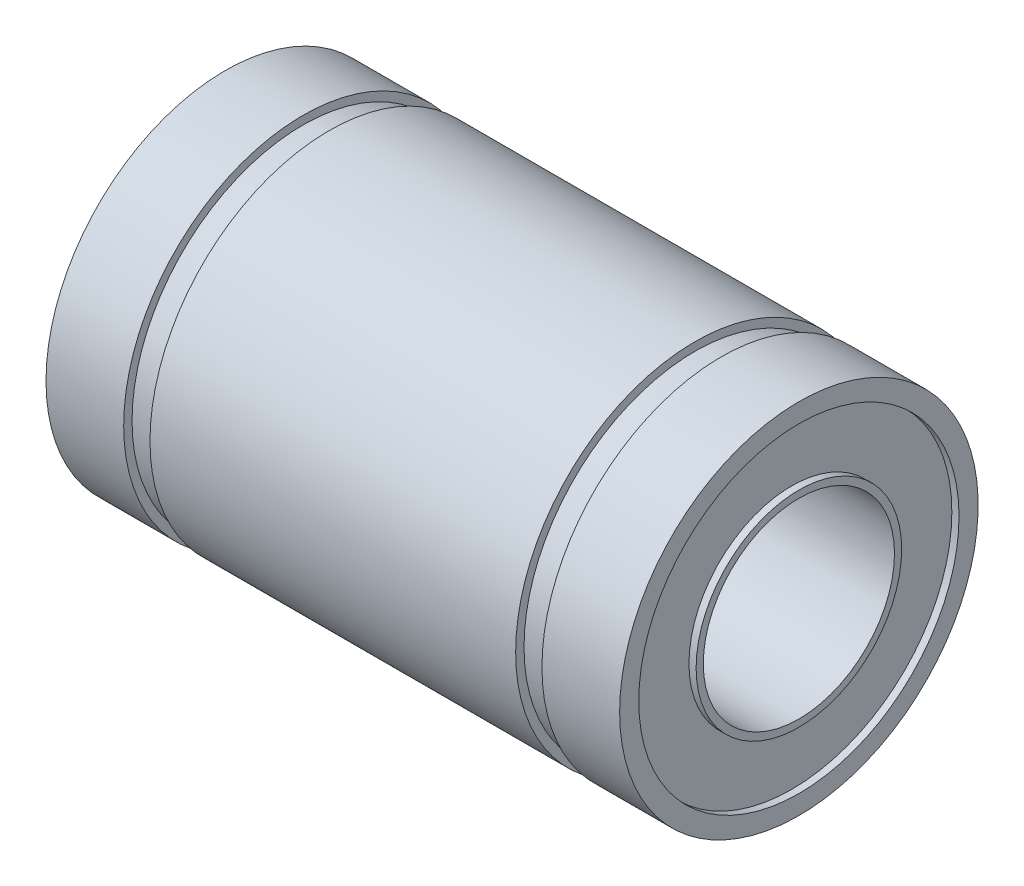
ISO-10303-21;
HEADER;
FILE_DESCRIPTION(('STEP AP214'),'2;1');
FILE_NAME('part.step','',(''),(''),'','','');
FILE_SCHEMA(('AUTOMOTIVE_DESIGN { 1 0 10303 214 1 1 1 1 }'));
ENDSEC;
DATA;
#1=APPLICATION_CONTEXT('core data for automotive mechanical design processes');
#2=APPLICATION_PROTOCOL_DEFINITION('international standard','automotive_design',2000,#1);
#3=PRODUCT_CONTEXT('',#1,'mechanical');
#4=PRODUCT('Part','Part','',(#3));
#5=PRODUCT_RELATED_PRODUCT_CATEGORY('part','',(#4));
#6=PRODUCT_DEFINITION_FORMATION('','',#4);
#7=PRODUCT_DEFINITION_CONTEXT('part definition',#1,'design');
#8=PRODUCT_DEFINITION('design','',#6,#7);
#9=PRODUCT_DEFINITION_SHAPE('','',#8);
#10=(LENGTH_UNIT() NAMED_UNIT(*) SI_UNIT(.MILLI.,.METRE.));
#11=(NAMED_UNIT(*) PLANE_ANGLE_UNIT() SI_UNIT($,.RADIAN.));
#12=(NAMED_UNIT(*) SI_UNIT($,.STERADIAN.) SOLID_ANGLE_UNIT());
#13=UNCERTAINTY_MEASURE_WITH_UNIT(LENGTH_MEASURE(1.E-05),#10,'distance_accuracy_value','');
#14=(GEOMETRIC_REPRESENTATION_CONTEXT(3) GLOBAL_UNCERTAINTY_ASSIGNED_CONTEXT((#13)) GLOBAL_UNIT_ASSIGNED_CONTEXT((#10,
#11,#12)) REPRESENTATION_CONTEXT('',''));
#15=CARTESIAN_POINT('',(0.,0.,0.));
#16=DIRECTION('',(0.,0.,1.));
#17=DIRECTION('',(1.,0.,0.));
#18=AXIS2_PLACEMENT_3D('',#15,#16,#17);
#19=CARTESIAN_POINT('',(-12.,4.,0.));
#20=DIRECTION('',(1.,0.,0.));
#21=DIRECTION('',(0.,0.,-1.));
#22=AXIS2_PLACEMENT_3D('',#19,#20,#21);
#23=PLANE('',#22);
#24=CARTESIAN_POINT('',(-12.,0.,0.));
#25=DIRECTION('',(-1.,0.,0.));
#26=DIRECTION('',(0.,0.,1.));
#27=AXIS2_PLACEMENT_3D('',#24,#25,#26);
#28=CIRCLE('',#27,4.);
#29=CARTESIAN_POINT('',(-12.,0.,4.));
#30=VERTEX_POINT('',#29);
#31=EDGE_CURVE('E99',#30,#30,#28,.T.);
#32=ORIENTED_EDGE('',*,*,#31,.F.);
#33=EDGE_LOOP('',(#32));
#34=FACE_BOUND('',#33,.T.);
#35=CARTESIAN_POINT('',(-12.,0.,0.));
#36=DIRECTION('',(-1.,0.,0.));
#37=DIRECTION('',(0.,0.,1.));
#38=AXIS2_PLACEMENT_3D('',#35,#36,#37);
#39=CIRCLE('',#38,4.3);
#40=CARTESIAN_POINT('',(-12.,0.,4.3));
#41=VERTEX_POINT('',#40);
#42=EDGE_CURVE('E10',#41,#41,#39,.T.);
#43=ORIENTED_EDGE('',*,*,#42,.T.);
#44=EDGE_LOOP('',(#43));
#45=FACE_BOUND('',#44,.T.);
#46=ADVANCED_FACE('F35',(#34,#45),#23,.F.);
#47=CARTESIAN_POINT('',(-12.,0.,0.));
#48=DIRECTION('',(-1.,0.,0.));
#49=DIRECTION('',(0.,0.,1.));
#50=AXIS2_PLACEMENT_3D('',#47,#48,#49);
#51=CYLINDRICAL_SURFACE('',#50,4.3);
#52=ORIENTED_EDGE('',*,*,#42,.F.);
#53=EDGE_LOOP('',(#52));
#54=FACE_BOUND('',#53,.T.);
#55=CARTESIAN_POINT('',(-11.7,0.,0.));
#56=DIRECTION('',(-1.,0.,0.));
#57=DIRECTION('',(0.,0.,1.));
#58=AXIS2_PLACEMENT_3D('',#55,#56,#57);
#59=CIRCLE('',#58,4.3);
#60=CARTESIAN_POINT('',(-11.7,0.,4.3));
#61=VERTEX_POINT('',#60);
#62=EDGE_CURVE('E41',#61,#61,#59,.T.);
#63=ORIENTED_EDGE('',*,*,#62,.T.);
#64=EDGE_LOOP('',(#63));
#65=FACE_BOUND('',#64,.T.);
#66=ADVANCED_FACE('F106',(#54,#65),#51,.T.);
#67=CARTESIAN_POINT('',(-11.7,6.7,0.));
#68=DIRECTION('',(1.,0.,0.));
#69=DIRECTION('',(0.,0.,-1.));
#70=AXIS2_PLACEMENT_3D('',#67,#68,#69);
#71=PLANE('',#70);
#72=ORIENTED_EDGE('',*,*,#62,.F.);
#73=EDGE_LOOP('',(#72));
#74=FACE_BOUND('',#73,.T.);
#75=CARTESIAN_POINT('',(-11.7,0.,0.));
#76=DIRECTION('',(-1.,0.,0.));
#77=DIRECTION('',(0.,0.,1.));
#78=AXIS2_PLACEMENT_3D('',#75,#76,#77);
#79=CIRCLE('',#78,6.7);
#80=CARTESIAN_POINT('',(-11.7,0.,6.7));
#81=VERTEX_POINT('',#80);
#82=EDGE_CURVE('E45',#81,#81,#79,.T.);
#83=ORIENTED_EDGE('',*,*,#82,.T.);
#84=EDGE_LOOP('',(#83));
#85=FACE_BOUND('',#84,.T.);
#86=ADVANCED_FACE('F110',(#74,#85),#71,.F.);
#87=CARTESIAN_POINT('',(-12.,0.,0.));
#88=DIRECTION('',(-1.,0.,0.));
#89=DIRECTION('',(0.,0.,1.));
#90=AXIS2_PLACEMENT_3D('',#87,#88,#89);
#91=CYLINDRICAL_SURFACE('',#90,6.7);
#92=ORIENTED_EDGE('',*,*,#82,.F.);
#93=EDGE_LOOP('',(#92));
#94=FACE_BOUND('',#93,.T.);
#95=CARTESIAN_POINT('',(-12.,0.,0.));
#96=DIRECTION('',(-1.,0.,0.));
#97=DIRECTION('',(0.,0.,1.));
#98=AXIS2_PLACEMENT_3D('',#95,#96,#97);
#99=CIRCLE('',#98,6.7);
#100=CARTESIAN_POINT('',(-12.,0.,6.7));
#101=VERTEX_POINT('',#100);
#102=EDGE_CURVE('E49',#101,#101,#99,.T.);
#103=ORIENTED_EDGE('',*,*,#102,.T.);
#104=EDGE_LOOP('',(#103));
#105=FACE_BOUND('',#104,.T.);
#106=ADVANCED_FACE('F115',(#94,#105),#91,.F.);
#107=CARTESIAN_POINT('',(-12.,6.7,0.));
#108=DIRECTION('',(1.,0.,0.));
#109=DIRECTION('',(0.,0.,-1.));
#110=AXIS2_PLACEMENT_3D('',#107,#108,#109);
#111=PLANE('',#110);
#112=ORIENTED_EDGE('',*,*,#102,.F.);
#113=EDGE_LOOP('',(#112));
#114=FACE_BOUND('',#113,.T.);
#115=CARTESIAN_POINT('',(-12.,0.,0.));
#116=DIRECTION('',(-1.,0.,0.));
#117=DIRECTION('',(0.,0.,1.));
#118=AXIS2_PLACEMENT_3D('',#115,#116,#117);
#119=CIRCLE('',#118,7.5);
#120=CARTESIAN_POINT('',(-12.,0.,7.5));
#121=VERTEX_POINT('',#120);
#122=EDGE_CURVE('E54',#121,#121,#119,.T.);
#123=ORIENTED_EDGE('',*,*,#122,.T.);
#124=EDGE_LOOP('',(#123));
#125=FACE_BOUND('',#124,.T.);
#126=ADVANCED_FACE('F121',(#114,#125),#111,.F.);
#127=CARTESIAN_POINT('',(-12.,0.,0.));
#128=DIRECTION('',(-1.,0.,0.));
#129=DIRECTION('',(0.,0.,1.));
#130=AXIS2_PLACEMENT_3D('',#127,#128,#129);
#131=CYLINDRICAL_SURFACE('',#130,7.5);
#132=ORIENTED_EDGE('',*,*,#122,.F.);
#133=EDGE_LOOP('',(#132));
#134=FACE_BOUND('',#133,.T.);
#135=CARTESIAN_POINT('',(-8.75,0.,0.));
#136=DIRECTION('',(-1.,0.,0.));
#137=DIRECTION('',(0.,0.,1.));
#138=AXIS2_PLACEMENT_3D('',#135,#136,#137);
#139=CIRCLE('',#138,7.5);
#140=CARTESIAN_POINT('',(-8.75,0.,7.5));
#141=VERTEX_POINT('',#140);
#142=EDGE_CURVE('E57',#141,#141,#139,.T.);
#143=ORIENTED_EDGE('',*,*,#142,.T.);
#144=EDGE_LOOP('',(#143));
#145=FACE_BOUND('',#144,.T.);
#146=ADVANCED_FACE('F125',(#134,#145),#131,.T.);
#147=CARTESIAN_POINT('',(-8.75,7.5,0.));
#148=DIRECTION('',(-1.,0.,0.));
#149=DIRECTION('',(0.,0.,1.));
#150=AXIS2_PLACEMENT_3D('',#147,#148,#149);
#151=PLANE('',#150);
#152=ORIENTED_EDGE('',*,*,#142,.F.);
#153=EDGE_LOOP('',(#152));
#154=FACE_BOUND('',#153,.T.);
#155=CARTESIAN_POINT('',(-8.75,0.,0.));
#156=DIRECTION('',(-1.,0.,0.));
#157=DIRECTION('',(0.,0.,1.));
#158=AXIS2_PLACEMENT_3D('',#155,#156,#157);
#159=CIRCLE('',#158,7.15);
#160=CARTESIAN_POINT('',(-8.75,0.,7.15));
#161=VERTEX_POINT('',#160);
#162=EDGE_CURVE('E60',#161,#161,#159,.T.);
#163=ORIENTED_EDGE('',*,*,#162,.T.);
#164=EDGE_LOOP('',(#163));
#165=FACE_BOUND('',#164,.T.);
#166=ADVANCED_FACE('F129',(#154,#165),#151,.F.);
#167=CARTESIAN_POINT('',(-12.,0.,0.));
#168=DIRECTION('',(-1.,0.,0.));
#169=DIRECTION('',(0.,0.,1.));
#170=AXIS2_PLACEMENT_3D('',#167,#168,#169);
#171=CYLINDRICAL_SURFACE('',#170,7.15);
#172=ORIENTED_EDGE('',*,*,#162,.F.);
#173=EDGE_LOOP('',(#172));
#174=FACE_BOUND('',#173,.T.);
#175=CARTESIAN_POINT('',(-7.65,0.,0.));
#176=DIRECTION('',(-1.,0.,0.));
#177=DIRECTION('',(0.,0.,1.));
#178=AXIS2_PLACEMENT_3D('',#175,#176,#177);
#179=CIRCLE('',#178,7.15);
#180=CARTESIAN_POINT('',(-7.65,0.,7.15));
#181=VERTEX_POINT('',#180);
#182=EDGE_CURVE('E63',#181,#181,#179,.T.);
#183=ORIENTED_EDGE('',*,*,#182,.T.);
#184=EDGE_LOOP('',(#183));
#185=FACE_BOUND('',#184,.T.);
#186=ADVANCED_FACE('F133',(#174,#185),#171,.T.);
#187=CARTESIAN_POINT('',(-7.65,7.5,0.));
#188=DIRECTION('',(1.,0.,0.));
#189=DIRECTION('',(0.,0.,-1.));
#190=AXIS2_PLACEMENT_3D('',#187,#188,#189);
#191=PLANE('',#190);
#192=ORIENTED_EDGE('',*,*,#182,.F.);
#193=EDGE_LOOP('',(#192));
#194=FACE_BOUND('',#193,.T.);
#195=CARTESIAN_POINT('',(-7.65,0.,0.));
#196=DIRECTION('',(-1.,0.,0.));
#197=DIRECTION('',(0.,0.,1.));
#198=AXIS2_PLACEMENT_3D('',#195,#196,#197);
#199=CIRCLE('',#198,7.5);
#200=CARTESIAN_POINT('',(-7.65,0.,7.5));
#201=VERTEX_POINT('',#200);
#202=EDGE_CURVE('E66',#201,#201,#199,.T.);
#203=ORIENTED_EDGE('',*,*,#202,.T.);
#204=EDGE_LOOP('',(#203));
#205=FACE_BOUND('',#204,.T.);
#206=ADVANCED_FACE('F137',(#194,#205),#191,.F.);
#207=CARTESIAN_POINT('',(-12.,0.,0.));
#208=DIRECTION('',(-1.,0.,0.));
#209=DIRECTION('',(0.,0.,1.));
#210=AXIS2_PLACEMENT_3D('',#207,#208,#209);
#211=CYLINDRICAL_SURFACE('',#210,7.5);
#212=ORIENTED_EDGE('',*,*,#202,.F.);
#213=EDGE_LOOP('',(#212));
#214=FACE_BOUND('',#213,.T.);
#215=CARTESIAN_POINT('',(7.65,0.,0.));
#216=DIRECTION('',(-1.,0.,0.));
#217=DIRECTION('',(0.,0.,1.));
#218=AXIS2_PLACEMENT_3D('',#215,#216,#217);
#219=CIRCLE('',#218,7.5);
#220=CARTESIAN_POINT('',(7.65,0.,7.5));
#221=VERTEX_POINT('',#220);
#222=EDGE_CURVE('E69',#221,#221,#219,.T.);
#223=ORIENTED_EDGE('',*,*,#222,.T.);
#224=EDGE_LOOP('',(#223));
#225=FACE_BOUND('',#224,.T.);
#226=ADVANCED_FACE('F141',(#214,#225),#211,.T.);
#227=CARTESIAN_POINT('',(7.65,7.5,0.));
#228=DIRECTION('',(-1.,0.,0.));
#229=DIRECTION('',(0.,0.,1.));
#230=AXIS2_PLACEMENT_3D('',#227,#228,#229);
#231=PLANE('',#230);
#232=ORIENTED_EDGE('',*,*,#222,.F.);
#233=EDGE_LOOP('',(#232));
#234=FACE_BOUND('',#233,.T.);
#235=CARTESIAN_POINT('',(7.65,0.,0.));
#236=DIRECTION('',(-1.,0.,0.));
#237=DIRECTION('',(0.,0.,1.));
#238=AXIS2_PLACEMENT_3D('',#235,#236,#237);
#239=CIRCLE('',#238,7.15);
#240=CARTESIAN_POINT('',(7.65,0.,7.15));
#241=VERTEX_POINT('',#240);
#242=EDGE_CURVE('E72',#241,#241,#239,.T.);
#243=ORIENTED_EDGE('',*,*,#242,.T.);
#244=EDGE_LOOP('',(#243));
#245=FACE_BOUND('',#244,.T.);
#246=ADVANCED_FACE('F145',(#234,#245),#231,.F.);
#247=CARTESIAN_POINT('',(-12.,0.,0.));
#248=DIRECTION('',(-1.,0.,0.));
#249=DIRECTION('',(0.,0.,1.));
#250=AXIS2_PLACEMENT_3D('',#247,#248,#249);
#251=CYLINDRICAL_SURFACE('',#250,7.15);
#252=ORIENTED_EDGE('',*,*,#242,.F.);
#253=EDGE_LOOP('',(#252));
#254=FACE_BOUND('',#253,.T.);
#255=CARTESIAN_POINT('',(8.75,0.,0.));
#256=DIRECTION('',(-1.,0.,0.));
#257=DIRECTION('',(0.,0.,1.));
#258=AXIS2_PLACEMENT_3D('',#255,#256,#257);
#259=CIRCLE('',#258,7.15);
#260=CARTESIAN_POINT('',(8.75,0.,7.15));
#261=VERTEX_POINT('',#260);
#262=EDGE_CURVE('E75',#261,#261,#259,.T.);
#263=ORIENTED_EDGE('',*,*,#262,.T.);
#264=EDGE_LOOP('',(#263));
#265=FACE_BOUND('',#264,.T.);
#266=ADVANCED_FACE('F149',(#254,#265),#251,.T.);
#267=CARTESIAN_POINT('',(8.75,7.5,0.));
#268=DIRECTION('',(1.,0.,0.));
#269=DIRECTION('',(0.,0.,-1.));
#270=AXIS2_PLACEMENT_3D('',#267,#268,#269);
#271=PLANE('',#270);
#272=ORIENTED_EDGE('',*,*,#262,.F.);
#273=EDGE_LOOP('',(#272));
#274=FACE_BOUND('',#273,.T.);
#275=CARTESIAN_POINT('',(8.75,0.,0.));
#276=DIRECTION('',(-1.,0.,0.));
#277=DIRECTION('',(0.,0.,1.));
#278=AXIS2_PLACEMENT_3D('',#275,#276,#277);
#279=CIRCLE('',#278,7.5);
#280=CARTESIAN_POINT('',(8.75,0.,7.5));
#281=VERTEX_POINT('',#280);
#282=EDGE_CURVE('E78',#281,#281,#279,.T.);
#283=ORIENTED_EDGE('',*,*,#282,.T.);
#284=EDGE_LOOP('',(#283));
#285=FACE_BOUND('',#284,.T.);
#286=ADVANCED_FACE('F153',(#274,#285),#271,.F.);
#287=CARTESIAN_POINT('',(-12.,0.,0.));
#288=DIRECTION('',(-1.,0.,0.));
#289=DIRECTION('',(0.,0.,1.));
#290=AXIS2_PLACEMENT_3D('',#287,#288,#289);
#291=CYLINDRICAL_SURFACE('',#290,7.5);
#292=ORIENTED_EDGE('',*,*,#282,.F.);
#293=EDGE_LOOP('',(#292));
#294=FACE_BOUND('',#293,.T.);
#295=CARTESIAN_POINT('',(12.,0.,0.));
#296=DIRECTION('',(-1.,0.,0.));
#297=DIRECTION('',(0.,0.,1.));
#298=AXIS2_PLACEMENT_3D('',#295,#296,#297);
#299=CIRCLE('',#298,7.5);
#300=CARTESIAN_POINT('',(12.,0.,7.5));
#301=VERTEX_POINT('',#300);
#302=EDGE_CURVE('E81',#301,#301,#299,.T.);
#303=ORIENTED_EDGE('',*,*,#302,.T.);
#304=EDGE_LOOP('',(#303));
#305=FACE_BOUND('',#304,.T.);
#306=ADVANCED_FACE('F157',(#294,#305),#291,.T.);
#307=CARTESIAN_POINT('',(12.,6.7,0.));
#308=DIRECTION('',(-1.,0.,0.));
#309=DIRECTION('',(0.,0.,1.));
#310=AXIS2_PLACEMENT_3D('',#307,#308,#309);
#311=PLANE('',#310);
#312=ORIENTED_EDGE('',*,*,#302,.F.);
#313=EDGE_LOOP('',(#312));
#314=FACE_BOUND('',#313,.T.);
#315=CARTESIAN_POINT('',(12.,0.,0.));
#316=DIRECTION('',(-1.,0.,0.));
#317=DIRECTION('',(0.,0.,1.));
#318=AXIS2_PLACEMENT_3D('',#315,#316,#317);
#319=CIRCLE('',#318,6.7);
#320=CARTESIAN_POINT('',(12.,0.,6.7));
#321=VERTEX_POINT('',#320);
#322=EDGE_CURVE('E84',#321,#321,#319,.T.);
#323=ORIENTED_EDGE('',*,*,#322,.T.);
#324=EDGE_LOOP('',(#323));
#325=FACE_BOUND('',#324,.T.);
#326=ADVANCED_FACE('F161',(#314,#325),#311,.F.);
#327=CARTESIAN_POINT('',(-12.,0.,0.));
#328=DIRECTION('',(-1.,0.,0.));
#329=DIRECTION('',(0.,0.,1.));
#330=AXIS2_PLACEMENT_3D('',#327,#328,#329);
#331=CYLINDRICAL_SURFACE('',#330,6.7);
#332=ORIENTED_EDGE('',*,*,#322,.F.);
#333=EDGE_LOOP('',(#332));
#334=FACE_BOUND('',#333,.T.);
#335=CARTESIAN_POINT('',(11.7,0.,0.));
#336=DIRECTION('',(-1.,0.,0.));
#337=DIRECTION('',(0.,0.,1.));
#338=AXIS2_PLACEMENT_3D('',#335,#336,#337);
#339=CIRCLE('',#338,6.7);
#340=CARTESIAN_POINT('',(11.7,0.,6.7));
#341=VERTEX_POINT('',#340);
#342=EDGE_CURVE('E87',#341,#341,#339,.T.);
#343=ORIENTED_EDGE('',*,*,#342,.T.);
#344=EDGE_LOOP('',(#343));
#345=FACE_BOUND('',#344,.T.);
#346=ADVANCED_FACE('F165',(#334,#345),#331,.F.);
#347=CARTESIAN_POINT('',(11.7,6.7,0.));
#348=DIRECTION('',(-1.,0.,0.));
#349=DIRECTION('',(0.,0.,1.));
#350=AXIS2_PLACEMENT_3D('',#347,#348,#349);
#351=PLANE('',#350);
#352=ORIENTED_EDGE('',*,*,#342,.F.);
#353=EDGE_LOOP('',(#352));
#354=FACE_BOUND('',#353,.T.);
#355=CARTESIAN_POINT('',(11.7,0.,0.));
#356=DIRECTION('',(-1.,0.,0.));
#357=DIRECTION('',(0.,0.,1.));
#358=AXIS2_PLACEMENT_3D('',#355,#356,#357);
#359=CIRCLE('',#358,4.3);
#360=CARTESIAN_POINT('',(11.7,0.,4.3));
#361=VERTEX_POINT('',#360);
#362=EDGE_CURVE('E90',#361,#361,#359,.T.);
#363=ORIENTED_EDGE('',*,*,#362,.T.);
#364=EDGE_LOOP('',(#363));
#365=FACE_BOUND('',#364,.T.);
#366=ADVANCED_FACE('F169',(#354,#365),#351,.F.);
#367=CARTESIAN_POINT('',(-12.,0.,0.));
#368=DIRECTION('',(-1.,0.,0.));
#369=DIRECTION('',(0.,0.,1.));
#370=AXIS2_PLACEMENT_3D('',#367,#368,#369);
#371=CYLINDRICAL_SURFACE('',#370,4.3);
#372=ORIENTED_EDGE('',*,*,#362,.F.);
#373=EDGE_LOOP('',(#372));
#374=FACE_BOUND('',#373,.T.);
#375=CARTESIAN_POINT('',(12.,0.,0.));
#376=DIRECTION('',(-1.,0.,0.));
#377=DIRECTION('',(0.,0.,1.));
#378=AXIS2_PLACEMENT_3D('',#375,#376,#377);
#379=CIRCLE('',#378,4.3);
#380=CARTESIAN_POINT('',(12.,0.,4.3));
#381=VERTEX_POINT('',#380);
#382=EDGE_CURVE('E93',#381,#381,#379,.T.);
#383=ORIENTED_EDGE('',*,*,#382,.T.);
#384=EDGE_LOOP('',(#383));
#385=FACE_BOUND('',#384,.T.);
#386=ADVANCED_FACE('F173',(#374,#385),#371,.T.);
#387=CARTESIAN_POINT('',(12.,4.,0.));
#388=DIRECTION('',(-1.,0.,0.));
#389=DIRECTION('',(0.,0.,1.));
#390=AXIS2_PLACEMENT_3D('',#387,#388,#389);
#391=PLANE('',#390);
#392=ORIENTED_EDGE('',*,*,#382,.F.);
#393=EDGE_LOOP('',(#392));
#394=FACE_BOUND('',#393,.T.);
#395=CARTESIAN_POINT('',(12.,0.,0.));
#396=DIRECTION('',(-1.,0.,0.));
#397=DIRECTION('',(0.,0.,1.));
#398=AXIS2_PLACEMENT_3D('',#395,#396,#397);
#399=CIRCLE('',#398,4.);
#400=CARTESIAN_POINT('',(12.,0.,4.));
#401=VERTEX_POINT('',#400);
#402=EDGE_CURVE('E96',#401,#401,#399,.T.);
#403=ORIENTED_EDGE('',*,*,#402,.T.);
#404=EDGE_LOOP('',(#403));
#405=FACE_BOUND('',#404,.T.);
#406=ADVANCED_FACE('F177',(#394,#405),#391,.F.);
#407=CARTESIAN_POINT('',(-12.,0.,0.));
#408=DIRECTION('',(-1.,0.,0.));
#409=DIRECTION('',(0.,0.,1.));
#410=AXIS2_PLACEMENT_3D('',#407,#408,#409);
#411=CYLINDRICAL_SURFACE('',#410,4.);
#412=ORIENTED_EDGE('',*,*,#402,.F.);
#413=EDGE_LOOP('',(#412));
#414=FACE_BOUND('',#413,.T.);
#415=ORIENTED_EDGE('',*,*,#31,.T.);
#416=EDGE_LOOP('',(#415));
#417=FACE_BOUND('',#416,.T.);
#418=ADVANCED_FACE('F103',(#414,#417),#411,.F.);
#419=CLOSED_SHELL('',(#46,#66,#86,#106,#126,#146,#166,#186,#206,#226,#246,#266,#286,#306,#326,
#346,#366,#386,#406,#418));
#420=MANIFOLD_SOLID_BREP('B2',#419);
#421=ADVANCED_BREP_SHAPE_REPRESENTATION('',(#18,#420),#14);
#422=SHAPE_DEFINITION_REPRESENTATION(#9,#421);
ENDSEC;
END-ISO-10303-21;
